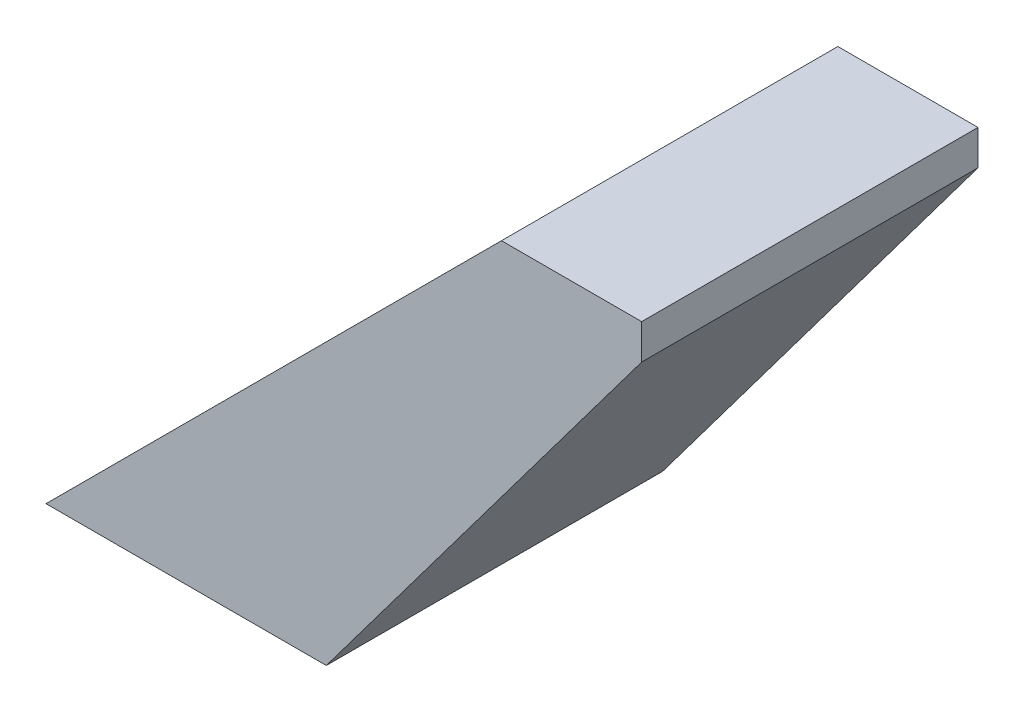
ISO-10303-21;
HEADER;
FILE_DESCRIPTION(('STEP AP214'),'2;1');
FILE_NAME('part.step','',(''),(''),'','','');
FILE_SCHEMA(('AUTOMOTIVE_DESIGN { 1 0 10303 214 1 1 1 1 }'));
ENDSEC;
DATA;
#1=APPLICATION_CONTEXT('core data for automotive mechanical design processes');
#2=APPLICATION_PROTOCOL_DEFINITION('international standard','automotive_design',2000,#1);
#3=PRODUCT_CONTEXT('',#1,'mechanical');
#4=PRODUCT('Part','Part','',(#3));
#5=PRODUCT_RELATED_PRODUCT_CATEGORY('part','',(#4));
#6=PRODUCT_DEFINITION_FORMATION('','',#4);
#7=PRODUCT_DEFINITION_CONTEXT('part definition',#1,'design');
#8=PRODUCT_DEFINITION('design','',#6,#7);
#9=PRODUCT_DEFINITION_SHAPE('','',#8);
#10=(LENGTH_UNIT() NAMED_UNIT(*) SI_UNIT(.MILLI.,.METRE.));
#11=(NAMED_UNIT(*) PLANE_ANGLE_UNIT() SI_UNIT($,.RADIAN.));
#12=(NAMED_UNIT(*) SI_UNIT($,.STERADIAN.) SOLID_ANGLE_UNIT());
#13=UNCERTAINTY_MEASURE_WITH_UNIT(LENGTH_MEASURE(1.E-05),#10,'distance_accuracy_value','');
#14=(GEOMETRIC_REPRESENTATION_CONTEXT(3) GLOBAL_UNCERTAINTY_ASSIGNED_CONTEXT((#13)) GLOBAL_UNIT_ASSIGNED_CONTEXT((#10,
#11,#12)) REPRESENTATION_CONTEXT('',''));
#15=CARTESIAN_POINT('',(0.,0.,0.));
#16=DIRECTION('',(0.,0.,1.));
#17=DIRECTION('',(1.,0.,0.));
#18=AXIS2_PLACEMENT_3D('',#15,#16,#17);
#19=CARTESIAN_POINT('',(0.6746875,0.4365625,0.));
#20=DIRECTION('',(0.8,-0.6,0.));
#21=DIRECTION('',(0.6,0.8,0.));
#22=AXIS2_PLACEMENT_3D('',#19,#20,#21);
#23=PLANE('',#22);
#24=DIRECTION('',(0.,0.,-1.));
#25=VECTOR('',#24,1.);
#26=CARTESIAN_POINT('',(-0.03968749999999,-0.5159375,0.));
#27=LINE('',#26,#25);
#28=CARTESIAN_POINT('',(-0.0396874999999932,-0.515937499999997,0.));
#29=VERTEX_POINT('',#28);
#30=CARTESIAN_POINT('',(-0.0396874999999932,-0.515937499999997,0.762));
#31=VERTEX_POINT('',#30);
#32=EDGE_CURVE('E70',#29,#31,#27,.F.);
#33=ORIENTED_EDGE('',*,*,#32,.F.);
#34=DIRECTION('',(0.599999999999995,0.800000000000004,0.));
#35=VECTOR('',#34,1.);
#36=CARTESIAN_POINT('',(-0.03968749999999,-0.5159375,0.));
#37=LINE('',#36,#35);
#38=CARTESIAN_POINT('',(0.6746875,0.4365625,0.));
#39=VERTEX_POINT('',#38);
#40=EDGE_CURVE('E67',#29,#39,#37,.T.);
#41=ORIENTED_EDGE('',*,*,#40,.T.);
#42=DIRECTION('',(0.,0.,-1.));
#43=VECTOR('',#42,1.);
#44=CARTESIAN_POINT('',(0.6746875,0.4365625,0.));
#45=LINE('',#44,#43);
#46=CARTESIAN_POINT('',(0.6746875,0.4365625,0.762));
#47=VERTEX_POINT('',#46);
#48=EDGE_CURVE('E20',#47,#39,#45,.T.);
#49=ORIENTED_EDGE('',*,*,#48,.F.);
#50=DIRECTION('',(0.599999999999995,0.800000000000004,0.));
#51=VECTOR('',#50,1.);
#52=CARTESIAN_POINT('',(-0.03968749999999,-0.5159375,0.762));
#53=LINE('',#52,#51);
#54=EDGE_CURVE('E62',#31,#47,#53,.T.);
#55=ORIENTED_EDGE('',*,*,#54,.F.);
#56=EDGE_LOOP('',(#33,#41,#49,#55));
#57=FACE_BOUND('',#56,.T.);
#58=ADVANCED_FACE('F17',(#57),#23,.T.);
#59=CARTESIAN_POINT('',(0.6746875,0.5159375,0.));
#60=DIRECTION('',(1.,0.,0.));
#61=DIRECTION('',(0.,0.,-1.));
#62=AXIS2_PLACEMENT_3D('',#59,#60,#61);
#63=PLANE('',#62);
#64=ORIENTED_EDGE('',*,*,#48,.T.);
#65=DIRECTION('',(0.,1.,0.));
#66=VECTOR('',#65,1.);
#67=CARTESIAN_POINT('',(0.6746875,-0.5159375,0.));
#68=LINE('',#67,#66);
#69=CARTESIAN_POINT('',(0.6746875,0.5159375,0.));
#70=VERTEX_POINT('',#69);
#71=EDGE_CURVE('E89',#39,#70,#68,.T.);
#72=ORIENTED_EDGE('',*,*,#71,.T.);
#73=DIRECTION('',(0.,0.,1.));
#74=VECTOR('',#73,1.);
#75=CARTESIAN_POINT('',(0.6746875,0.5159375,0.));
#76=LINE('',#75,#74);
#77=CARTESIAN_POINT('',(0.6746875,0.5159375,0.762));
#78=VERTEX_POINT('',#77);
#79=EDGE_CURVE('E74',#78,#70,#76,.F.);
#80=ORIENTED_EDGE('',*,*,#79,.F.);
#81=DIRECTION('',(0.,1.,0.));
#82=VECTOR('',#81,1.);
#83=CARTESIAN_POINT('',(0.6746875,-0.5159375,0.762));
#84=LINE('',#83,#82);
#85=EDGE_CURVE('E72',#47,#78,#84,.T.);
#86=ORIENTED_EDGE('',*,*,#85,.F.);
#87=EDGE_LOOP('',(#64,#72,#80,#86));
#88=FACE_BOUND('',#87,.T.);
#89=ADVANCED_FACE('F73',(#88),#63,.T.);
#90=CARTESIAN_POINT('',(-0.03968749999999,-0.5159375,0.));
#91=DIRECTION('',(0.,-1.,0.));
#92=DIRECTION('',(0.,0.,-1.));
#93=AXIS2_PLACEMENT_3D('',#90,#91,#92);
#94=PLANE('',#93);
#95=DIRECTION('',(0.,0.,1.));
#96=VECTOR('',#95,1.);
#97=CARTESIAN_POINT('',(-0.6746875,-0.5159375,0.));
#98=LINE('',#97,#96);
#99=CARTESIAN_POINT('',(-0.6746875,-0.5159375,0.));
#100=VERTEX_POINT('',#99);
#101=CARTESIAN_POINT('',(-0.6746875,-0.5159375,0.762));
#102=VERTEX_POINT('',#101);
#103=EDGE_CURVE('E95',#100,#102,#98,.T.);
#104=ORIENTED_EDGE('',*,*,#103,.F.);
#105=DIRECTION('',(1.,0.,0.));
#106=VECTOR('',#105,1.);
#107=CARTESIAN_POINT('',(-0.03968749999999,-0.5159375,0.));
#108=LINE('',#107,#106);
#109=EDGE_CURVE('E92',#100,#29,#108,.T.);
#110=ORIENTED_EDGE('',*,*,#109,.T.);
#111=ORIENTED_EDGE('',*,*,#32,.T.);
#112=DIRECTION('',(1.,0.,0.));
#113=VECTOR('',#112,1.);
#114=CARTESIAN_POINT('',(-0.03968749999999,-0.5159375,0.762));
#115=LINE('',#114,#113);
#116=EDGE_CURVE('E77',#102,#31,#115,.T.);
#117=ORIENTED_EDGE('',*,*,#116,.F.);
#118=EDGE_LOOP('',(#104,#110,#111,#117));
#119=FACE_BOUND('',#118,.T.);
#120=ADVANCED_FACE('F107',(#119),#94,.T.);
#121=CARTESIAN_POINT('',(-0.03968749999999,-0.5159375,0.762));
#122=DIRECTION('',(0.,0.,1.));
#123=DIRECTION('',(1.,0.,0.));
#124=AXIS2_PLACEMENT_3D('',#121,#122,#123);
#125=PLANE('',#124);
#126=DIRECTION('',(-0.707106781186548,-0.707106781186548,0.));
#127=VECTOR('',#126,1.);
#128=CARTESIAN_POINT('',(-0.6746875,-0.5159375,0.762));
#129=LINE('',#128,#127);
#130=CARTESIAN_POINT('',(0.3571875,0.5159375,0.762));
#131=VERTEX_POINT('',#130);
#132=EDGE_CURVE('E98',#102,#131,#129,.F.);
#133=ORIENTED_EDGE('',*,*,#132,.F.);
#134=ORIENTED_EDGE('',*,*,#116,.T.);
#135=ORIENTED_EDGE('',*,*,#54,.T.);
#136=ORIENTED_EDGE('',*,*,#85,.T.);
#137=DIRECTION('',(1.,0.,0.));
#138=VECTOR('',#137,1.);
#139=CARTESIAN_POINT('',(0.3571875,0.5159375,0.762));
#140=LINE('',#139,#138);
#141=EDGE_CURVE('E85',#131,#78,#140,.T.);
#142=ORIENTED_EDGE('',*,*,#141,.F.);
#143=EDGE_LOOP('',(#133,#134,#135,#136,#142));
#144=FACE_BOUND('',#143,.T.);
#145=ADVANCED_FACE('F81',(#144),#125,.T.);
#146=CARTESIAN_POINT('',(0.3571875,0.5159375,0.));
#147=DIRECTION('',(0.,1.,0.));
#148=DIRECTION('',(0.,0.,1.));
#149=AXIS2_PLACEMENT_3D('',#146,#147,#148);
#150=PLANE('',#149);
#151=ORIENTED_EDGE('',*,*,#79,.T.);
#152=DIRECTION('',(1.,0.,0.));
#153=VECTOR('',#152,1.);
#154=CARTESIAN_POINT('',(-0.03968749999999,0.5159375,0.));
#155=LINE('',#154,#153);
#156=CARTESIAN_POINT('',(0.3571875,0.5159375,0.));
#157=VERTEX_POINT('',#156);
#158=EDGE_CURVE('E35',#70,#157,#155,.F.);
#159=ORIENTED_EDGE('',*,*,#158,.T.);
#160=DIRECTION('',(0.,0.,1.));
#161=VECTOR('',#160,1.);
#162=CARTESIAN_POINT('',(0.3571875,0.5159375,0.));
#163=LINE('',#162,#161);
#164=EDGE_CURVE('E26',#131,#157,#163,.F.);
#165=ORIENTED_EDGE('',*,*,#164,.F.);
#166=ORIENTED_EDGE('',*,*,#141,.T.);
#167=EDGE_LOOP('',(#151,#159,#165,#166));
#168=FACE_BOUND('',#167,.T.);
#169=ADVANCED_FACE('F104',(#168),#150,.T.);
#170=CARTESIAN_POINT('',(-0.03968749999999,-0.5159375,0.));
#171=DIRECTION('',(0.,0.,1.));
#172=DIRECTION('',(1.,0.,0.));
#173=AXIS2_PLACEMENT_3D('',#170,#171,#172);
#174=PLANE('',#173);
#175=DIRECTION('',(-0.707106781186548,-0.707106781186548,0.));
#176=VECTOR('',#175,1.);
#177=CARTESIAN_POINT('',(-0.6746875,-0.5159375,0.));
#178=LINE('',#177,#176);
#179=EDGE_CURVE('E11',#157,#100,#178,.T.);
#180=ORIENTED_EDGE('',*,*,#179,.F.);
#181=ORIENTED_EDGE('',*,*,#158,.F.);
#182=ORIENTED_EDGE('',*,*,#71,.F.);
#183=ORIENTED_EDGE('',*,*,#40,.F.);
#184=ORIENTED_EDGE('',*,*,#109,.F.);
#185=EDGE_LOOP('',(#180,#181,#182,#183,#184));
#186=FACE_BOUND('',#185,.T.);
#187=ADVANCED_FACE('F109',(#186),#174,.F.);
#188=CARTESIAN_POINT('',(-0.6746875,-0.5159375,0.));
#189=DIRECTION('',(-0.707106781186548,0.707106781186548,0.));
#190=DIRECTION('',(-0.707106781186548,-0.707106781186548,0.));
#191=AXIS2_PLACEMENT_3D('',#188,#189,#190);
#192=PLANE('',#191);
#193=ORIENTED_EDGE('',*,*,#164,.T.);
#194=ORIENTED_EDGE('',*,*,#179,.T.);
#195=ORIENTED_EDGE('',*,*,#103,.T.);
#196=ORIENTED_EDGE('',*,*,#132,.T.);
#197=EDGE_LOOP('',(#193,#194,#195,#196));
#198=FACE_BOUND('',#197,.T.);
#199=ADVANCED_FACE('F103',(#198),#192,.T.);
#200=CLOSED_SHELL('',(#58,#89,#120,#145,#169,#187,#199));
#201=MANIFOLD_SOLID_BREP('B1',#200);
#202=ADVANCED_BREP_SHAPE_REPRESENTATION('',(#18,#201),#14);
#203=SHAPE_DEFINITION_REPRESENTATION(#9,#202);
ENDSEC;
END-ISO-10303-21;
